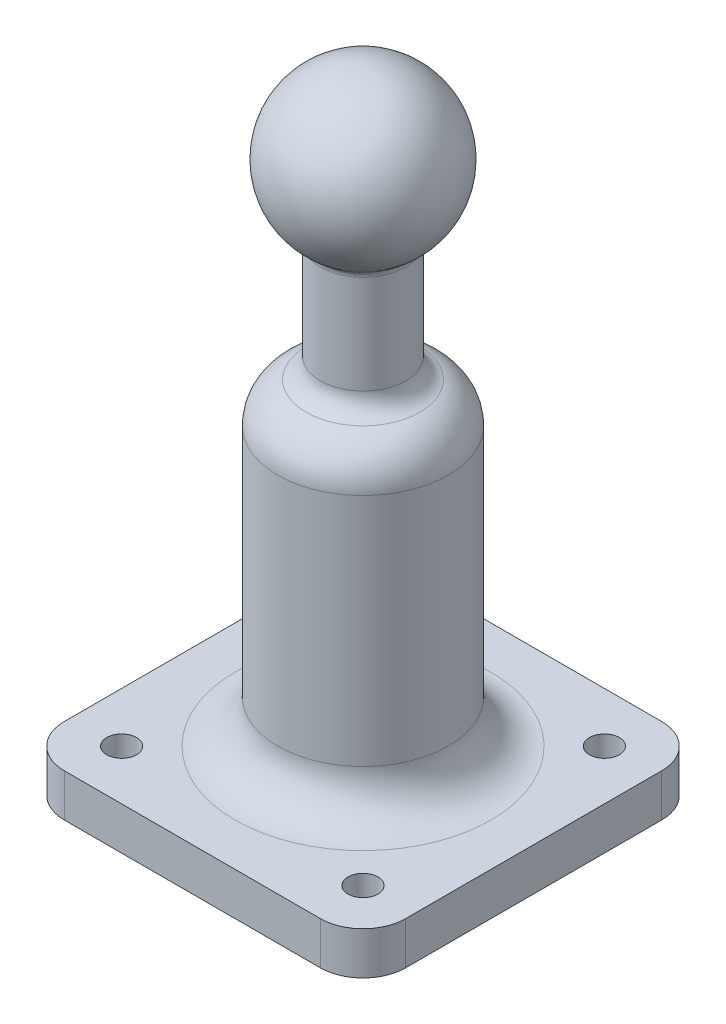
ISO-10303-21;
HEADER;
FILE_DESCRIPTION(('STEP AP214'),'2;1');
FILE_NAME('part.step','',(''),(''),'','','');
FILE_SCHEMA(('AUTOMOTIVE_DESIGN { 1 0 10303 214 1 1 1 1 }'));
ENDSEC;
DATA;
#1=APPLICATION_CONTEXT('core data for automotive mechanical design processes');
#2=APPLICATION_PROTOCOL_DEFINITION('international standard','automotive_design',2000,#1);
#3=PRODUCT_CONTEXT('',#1,'mechanical');
#4=PRODUCT('Part','Part','',(#3));
#5=PRODUCT_RELATED_PRODUCT_CATEGORY('part','',(#4));
#6=PRODUCT_DEFINITION_FORMATION('','',#4);
#7=PRODUCT_DEFINITION_CONTEXT('part definition',#1,'design');
#8=PRODUCT_DEFINITION('design','',#6,#7);
#9=PRODUCT_DEFINITION_SHAPE('','',#8);
#10=(LENGTH_UNIT() NAMED_UNIT(*) SI_UNIT(.MILLI.,.METRE.));
#11=(NAMED_UNIT(*) PLANE_ANGLE_UNIT() SI_UNIT($,.RADIAN.));
#12=(NAMED_UNIT(*) SI_UNIT($,.STERADIAN.) SOLID_ANGLE_UNIT());
#13=UNCERTAINTY_MEASURE_WITH_UNIT(LENGTH_MEASURE(1.E-05),#10,'distance_accuracy_value','');
#14=(GEOMETRIC_REPRESENTATION_CONTEXT(3) GLOBAL_UNCERTAINTY_ASSIGNED_CONTEXT((#13)) GLOBAL_UNIT_ASSIGNED_CONTEXT((#10,
#11,#12)) REPRESENTATION_CONTEXT('',''));
#15=CARTESIAN_POINT('',(0.,0.,0.));
#16=DIRECTION('',(0.,0.,1.));
#17=DIRECTION('',(1.,0.,0.));
#18=AXIS2_PLACEMENT_3D('',#15,#16,#17);
#19=CARTESIAN_POINT('',(-30.,10.,30.));
#20=DIRECTION('',(0.,1.,0.));
#21=DIRECTION('',(0.,0.,1.));
#22=AXIS2_PLACEMENT_3D('',#19,#20,#21);
#23=PLANE('',#22);
#24=CARTESIAN_POINT('',(0.,10.,0.));
#25=DIRECTION('',(0.,1.,0.));
#26=DIRECTION('',(0.,0.,1.));
#27=AXIS2_PLACEMENT_3D('',#24,#25,#26);
#28=CIRCLE('',#27,30.);
#29=CARTESIAN_POINT('',(0.,10.,30.));
#30=VERTEX_POINT('',#29);
#31=EDGE_CURVE('E170',#30,#30,#28,.F.);
#32=ORIENTED_EDGE('',*,*,#31,.T.);
#33=EDGE_LOOP('',(#32));
#34=FACE_BOUND('',#33,.T.);
#35=CARTESIAN_POINT('',(28.2842712474619,10.,28.2842712474619));
#36=DIRECTION('',(0.,1.,0.));
#37=DIRECTION('',(0.,0.,1.));
#38=AXIS2_PLACEMENT_3D('',#35,#36,#37);
#39=CIRCLE('',#38,3.5);
#40=CARTESIAN_POINT('',(28.2842712474619,10.,31.7842712474619));
#41=VERTEX_POINT('',#40);
#42=EDGE_CURVE('E284',#41,#41,#39,.T.);
#43=ORIENTED_EDGE('',*,*,#42,.F.);
#44=EDGE_LOOP('',(#43));
#45=FACE_BOUND('',#44,.T.);
#46=CARTESIAN_POINT('',(-28.2842712474619,10.,-28.2842712474619));
#47=DIRECTION('',(0.,1.,0.));
#48=DIRECTION('',(0.,0.,1.));
#49=AXIS2_PLACEMENT_3D('',#46,#47,#48);
#50=CIRCLE('',#49,3.5);
#51=CARTESIAN_POINT('',(-28.2842712474619,10.,-24.7842712474619));
#52=VERTEX_POINT('',#51);
#53=EDGE_CURVE('E138',#52,#52,#50,.T.);
#54=ORIENTED_EDGE('',*,*,#53,.F.);
#55=EDGE_LOOP('',(#54));
#56=FACE_BOUND('',#55,.T.);
#57=CARTESIAN_POINT('',(-30.,10.,30.));
#58=DIRECTION('',(0.,1.,0.));
#59=DIRECTION('',(0.,0.,1.));
#60=AXIS2_PLACEMENT_3D('',#57,#58,#59);
#61=CIRCLE('',#60,10.);
#62=CARTESIAN_POINT('',(-40.,10.,29.9999999999999));
#63=VERTEX_POINT('',#62);
#64=CARTESIAN_POINT('',(-29.9999999999999,10.,40.));
#65=VERTEX_POINT('',#64);
#66=EDGE_CURVE('E149',#63,#65,#61,.T.);
#67=ORIENTED_EDGE('',*,*,#66,.T.);
#68=DIRECTION('',(1.,0.,0.));
#69=VECTOR('',#68,1.);
#70=CARTESIAN_POINT('',(-29.9999999999999,10.,40.));
#71=LINE('',#70,#69);
#72=CARTESIAN_POINT('',(29.9999999999999,10.,40.));
#73=VERTEX_POINT('',#72);
#74=EDGE_CURVE('E97',#65,#73,#71,.T.);
#75=ORIENTED_EDGE('',*,*,#74,.T.);
#76=CARTESIAN_POINT('',(30.,10.,30.));
#77=DIRECTION('',(0.,1.,0.));
#78=DIRECTION('',(0.,0.,1.));
#79=AXIS2_PLACEMENT_3D('',#76,#77,#78);
#80=CIRCLE('',#79,10.);
#81=CARTESIAN_POINT('',(40.,10.,29.9999999999999));
#82=VERTEX_POINT('',#81);
#83=EDGE_CURVE('E299',#73,#82,#80,.T.);
#84=ORIENTED_EDGE('',*,*,#83,.T.);
#85=DIRECTION('',(0.,0.,-1.));
#86=VECTOR('',#85,1.);
#87=CARTESIAN_POINT('',(40.,10.,-29.9999999999999));
#88=LINE('',#87,#86);
#89=CARTESIAN_POINT('',(40.,10.,-29.9999999999999));
#90=VERTEX_POINT('',#89);
#91=EDGE_CURVE('E301',#82,#90,#88,.T.);
#92=ORIENTED_EDGE('',*,*,#91,.T.);
#93=CARTESIAN_POINT('',(30.,10.,-30.));
#94=DIRECTION('',(0.,1.,0.));
#95=DIRECTION('',(0.,0.,-1.));
#96=AXIS2_PLACEMENT_3D('',#93,#94,#95);
#97=CIRCLE('',#96,10.);
#98=CARTESIAN_POINT('',(29.9999999999999,10.,-40.));
#99=VERTEX_POINT('',#98);
#100=EDGE_CURVE('E116',#90,#99,#97,.T.);
#101=ORIENTED_EDGE('',*,*,#100,.T.);
#102=DIRECTION('',(-1.,0.,0.));
#103=VECTOR('',#102,1.);
#104=CARTESIAN_POINT('',(-29.9999999999999,10.,-40.));
#105=LINE('',#104,#103);
#106=CARTESIAN_POINT('',(-29.9999999999999,10.,-40.));
#107=VERTEX_POINT('',#106);
#108=EDGE_CURVE('E110',#99,#107,#105,.T.);
#109=ORIENTED_EDGE('',*,*,#108,.T.);
#110=CARTESIAN_POINT('',(-30.,10.,-30.));
#111=DIRECTION('',(0.,1.,0.));
#112=DIRECTION('',(0.,0.,1.));
#113=AXIS2_PLACEMENT_3D('',#110,#111,#112);
#114=CIRCLE('',#113,10.);
#115=CARTESIAN_POINT('',(-40.,10.,-29.9999999999999));
#116=VERTEX_POINT('',#115);
#117=EDGE_CURVE('E114',#107,#116,#114,.T.);
#118=ORIENTED_EDGE('',*,*,#117,.T.);
#119=DIRECTION('',(0.,0.,1.));
#120=VECTOR('',#119,1.);
#121=CARTESIAN_POINT('',(-40.,10.,-29.9999999999999));
#122=LINE('',#121,#120);
#123=EDGE_CURVE('E53',#116,#63,#122,.T.);
#124=ORIENTED_EDGE('',*,*,#123,.T.);
#125=EDGE_LOOP('',(#67,#75,#84,#92,#101,#109,#118,#124));
#126=FACE_BOUND('',#125,.T.);
#127=CARTESIAN_POINT('',(28.2842712474619,10.,-28.2842712474619));
#128=DIRECTION('',(0.,1.,0.));
#129=DIRECTION('',(0.,0.,1.));
#130=AXIS2_PLACEMENT_3D('',#127,#128,#129);
#131=CIRCLE('',#130,3.5);
#132=CARTESIAN_POINT('',(28.2842712474619,10.,-24.7842712474619));
#133=VERTEX_POINT('',#132);
#134=EDGE_CURVE('E279',#133,#133,#131,.T.);
#135=ORIENTED_EDGE('',*,*,#134,.F.);
#136=EDGE_LOOP('',(#135));
#137=FACE_BOUND('',#136,.T.);
#138=CARTESIAN_POINT('',(-28.2842712474619,10.,28.2842712474619));
#139=DIRECTION('',(0.,1.,0.));
#140=DIRECTION('',(0.,0.,1.));
#141=AXIS2_PLACEMENT_3D('',#138,#139,#140);
#142=CIRCLE('',#141,3.5);
#143=CARTESIAN_POINT('',(-28.2842712474619,10.,31.7842712474619));
#144=VERTEX_POINT('',#143);
#145=EDGE_CURVE('E322',#144,#144,#142,.T.);
#146=ORIENTED_EDGE('',*,*,#145,.F.);
#147=EDGE_LOOP('',(#146));
#148=FACE_BOUND('',#147,.T.);
#149=ADVANCED_FACE('F36',(#34,#45,#56,#126,#137,#148),#23,.T.);
#150=CARTESIAN_POINT('',(-30.,0.,30.));
#151=DIRECTION('',(0.,1.,0.));
#152=DIRECTION('',(0.,0.,1.));
#153=AXIS2_PLACEMENT_3D('',#150,#151,#152);
#154=PLANE('',#153);
#155=CARTESIAN_POINT('',(-30.,0.,30.));
#156=DIRECTION('',(0.,1.,0.));
#157=DIRECTION('',(0.,0.,1.));
#158=AXIS2_PLACEMENT_3D('',#155,#156,#157);
#159=CIRCLE('',#158,10.);
#160=CARTESIAN_POINT('',(-40.,0.,29.9999999999999));
#161=VERTEX_POINT('',#160);
#162=CARTESIAN_POINT('',(-29.9999999999999,0.,40.));
#163=VERTEX_POINT('',#162);
#164=EDGE_CURVE('E134',#161,#163,#159,.T.);
#165=ORIENTED_EDGE('',*,*,#164,.F.);
#166=DIRECTION('',(0.,0.,1.));
#167=VECTOR('',#166,1.);
#168=CARTESIAN_POINT('',(-40.,0.,-29.9999999999999));
#169=LINE('',#168,#167);
#170=CARTESIAN_POINT('',(-40.,0.,-29.9999999999999));
#171=VERTEX_POINT('',#170);
#172=EDGE_CURVE('E88',#171,#161,#169,.T.);
#173=ORIENTED_EDGE('',*,*,#172,.F.);
#174=CARTESIAN_POINT('',(-30.,0.,-30.));
#175=DIRECTION('',(0.,1.,0.));
#176=DIRECTION('',(0.,0.,1.));
#177=AXIS2_PLACEMENT_3D('',#174,#175,#176);
#178=CIRCLE('',#177,10.);
#179=CARTESIAN_POINT('',(-29.9999999999999,0.,-40.));
#180=VERTEX_POINT('',#179);
#181=EDGE_CURVE('E82',#180,#171,#178,.T.);
#182=ORIENTED_EDGE('',*,*,#181,.F.);
#183=DIRECTION('',(-1.,0.,0.));
#184=VECTOR('',#183,1.);
#185=CARTESIAN_POINT('',(-29.9999999999999,0.,-40.));
#186=LINE('',#185,#184);
#187=CARTESIAN_POINT('',(29.9999999999999,0.,-40.));
#188=VERTEX_POINT('',#187);
#189=EDGE_CURVE('E124',#188,#180,#186,.T.);
#190=ORIENTED_EDGE('',*,*,#189,.F.);
#191=CARTESIAN_POINT('',(30.,0.,-30.));
#192=DIRECTION('',(0.,1.,0.));
#193=DIRECTION('',(0.,0.,-1.));
#194=AXIS2_PLACEMENT_3D('',#191,#192,#193);
#195=CIRCLE('',#194,10.);
#196=CARTESIAN_POINT('',(40.,0.,-29.9999999999999));
#197=VERTEX_POINT('',#196);
#198=EDGE_CURVE('E144',#197,#188,#195,.T.);
#199=ORIENTED_EDGE('',*,*,#198,.F.);
#200=DIRECTION('',(0.,0.,-1.));
#201=VECTOR('',#200,1.);
#202=CARTESIAN_POINT('',(40.,0.,-29.9999999999999));
#203=LINE('',#202,#201);
#204=CARTESIAN_POINT('',(40.,0.,29.9999999999999));
#205=VERTEX_POINT('',#204);
#206=EDGE_CURVE('E142',#205,#197,#203,.T.);
#207=ORIENTED_EDGE('',*,*,#206,.F.);
#208=CARTESIAN_POINT('',(30.,0.,30.));
#209=DIRECTION('',(0.,1.,0.));
#210=DIRECTION('',(0.,0.,1.));
#211=AXIS2_PLACEMENT_3D('',#208,#209,#210);
#212=CIRCLE('',#211,10.);
#213=CARTESIAN_POINT('',(29.9999999999999,0.,40.));
#214=VERTEX_POINT('',#213);
#215=EDGE_CURVE('E140',#214,#205,#212,.T.);
#216=ORIENTED_EDGE('',*,*,#215,.F.);
#217=DIRECTION('',(1.,0.,0.));
#218=VECTOR('',#217,1.);
#219=CARTESIAN_POINT('',(-29.9999999999999,0.,40.));
#220=LINE('',#219,#218);
#221=EDGE_CURVE('E137',#163,#214,#220,.T.);
#222=ORIENTED_EDGE('',*,*,#221,.F.);
#223=EDGE_LOOP('',(#165,#173,#182,#190,#199,#207,#216,#222));
#224=FACE_BOUND('',#223,.T.);
#225=CARTESIAN_POINT('',(-28.2842712474619,0.,-28.2842712474619));
#226=DIRECTION('',(0.,1.,0.));
#227=DIRECTION('',(0.,0.,1.));
#228=AXIS2_PLACEMENT_3D('',#225,#226,#227);
#229=CIRCLE('',#228,3.5);
#230=CARTESIAN_POINT('',(-28.2842712474619,0.,-24.7842712474619));
#231=VERTEX_POINT('',#230);
#232=EDGE_CURVE('E286',#231,#231,#229,.T.);
#233=ORIENTED_EDGE('',*,*,#232,.T.);
#234=EDGE_LOOP('',(#233));
#235=FACE_BOUND('',#234,.T.);
#236=CARTESIAN_POINT('',(28.2842712474619,0.,-28.2842712474619));
#237=DIRECTION('',(0.,1.,0.));
#238=DIRECTION('',(0.,0.,1.));
#239=AXIS2_PLACEMENT_3D('',#236,#237,#238);
#240=CIRCLE('',#239,3.5);
#241=CARTESIAN_POINT('',(28.2842712474619,0.,-24.7842712474619));
#242=VERTEX_POINT('',#241);
#243=EDGE_CURVE('E282',#242,#242,#240,.T.);
#244=ORIENTED_EDGE('',*,*,#243,.T.);
#245=EDGE_LOOP('',(#244));
#246=FACE_BOUND('',#245,.T.);
#247=CARTESIAN_POINT('',(28.2842712474619,0.,28.2842712474619));
#248=DIRECTION('',(0.,1.,0.));
#249=DIRECTION('',(0.,0.,1.));
#250=AXIS2_PLACEMENT_3D('',#247,#248,#249);
#251=CIRCLE('',#250,3.5);
#252=CARTESIAN_POINT('',(28.2842712474619,0.,31.7842712474619));
#253=VERTEX_POINT('',#252);
#254=EDGE_CURVE('E289',#253,#253,#251,.T.);
#255=ORIENTED_EDGE('',*,*,#254,.T.);
#256=EDGE_LOOP('',(#255));
#257=FACE_BOUND('',#256,.T.);
#258=CARTESIAN_POINT('',(-28.2842712474619,0.,28.2842712474619));
#259=DIRECTION('',(0.,1.,0.));
#260=DIRECTION('',(0.,0.,1.));
#261=AXIS2_PLACEMENT_3D('',#258,#259,#260);
#262=CIRCLE('',#261,3.5);
#263=CARTESIAN_POINT('',(-28.2842712474619,0.,31.7842712474619));
#264=VERTEX_POINT('',#263);
#265=EDGE_CURVE('E320',#264,#264,#262,.T.);
#266=ORIENTED_EDGE('',*,*,#265,.T.);
#267=EDGE_LOOP('',(#266));
#268=FACE_BOUND('',#267,.T.);
#269=ADVANCED_FACE('F195',(#224,#235,#246,#257,#268),#154,.F.);
#270=CARTESIAN_POINT('',(-30.,10.,30.));
#271=DIRECTION('',(0.,-1.,0.));
#272=DIRECTION('',(0.,0.,-1.));
#273=AXIS2_PLACEMENT_3D('',#270,#271,#272);
#274=CYLINDRICAL_SURFACE('',#273,10.);
#275=ORIENTED_EDGE('',*,*,#164,.T.);
#276=DIRECTION('',(0.,-1.,0.));
#277=VECTOR('',#276,1.);
#278=CARTESIAN_POINT('',(-29.9999999999999,10.,40.));
#279=LINE('',#278,#277);
#280=EDGE_CURVE('E162',#65,#163,#279,.T.);
#281=ORIENTED_EDGE('',*,*,#280,.F.);
#282=ORIENTED_EDGE('',*,*,#66,.F.);
#283=DIRECTION('',(0.,-1.,0.));
#284=VECTOR('',#283,1.);
#285=CARTESIAN_POINT('',(-40.,10.,29.9999999999999));
#286=LINE('',#285,#284);
#287=EDGE_CURVE('E130',#63,#161,#286,.T.);
#288=ORIENTED_EDGE('',*,*,#287,.T.);
#289=EDGE_LOOP('',(#275,#281,#282,#288));
#290=FACE_BOUND('',#289,.T.);
#291=ADVANCED_FACE('F201',(#290),#274,.T.);
#292=CARTESIAN_POINT('',(-29.9999999999999,10.,40.));
#293=DIRECTION('',(0.,0.,-1.));
#294=DIRECTION('',(-1.,0.,0.));
#295=AXIS2_PLACEMENT_3D('',#292,#293,#294);
#296=PLANE('',#295);
#297=ORIENTED_EDGE('',*,*,#221,.T.);
#298=DIRECTION('',(0.,-1.,0.));
#299=VECTOR('',#298,1.);
#300=CARTESIAN_POINT('',(29.9999999999999,10.,40.));
#301=LINE('',#300,#299);
#302=EDGE_CURVE('E159',#73,#214,#301,.T.);
#303=ORIENTED_EDGE('',*,*,#302,.F.);
#304=ORIENTED_EDGE('',*,*,#74,.F.);
#305=ORIENTED_EDGE('',*,*,#280,.T.);
#306=EDGE_LOOP('',(#297,#303,#304,#305));
#307=FACE_BOUND('',#306,.T.);
#308=ADVANCED_FACE('F227',(#307),#296,.F.);
#309=CARTESIAN_POINT('',(30.,10.,30.));
#310=DIRECTION('',(0.,-1.,0.));
#311=DIRECTION('',(0.,0.,-1.));
#312=AXIS2_PLACEMENT_3D('',#309,#310,#311);
#313=CYLINDRICAL_SURFACE('',#312,10.);
#314=ORIENTED_EDGE('',*,*,#215,.T.);
#315=DIRECTION('',(0.,-1.,0.));
#316=VECTOR('',#315,1.);
#317=CARTESIAN_POINT('',(40.,10.,29.9999999999999));
#318=LINE('',#317,#316);
#319=EDGE_CURVE('E156',#82,#205,#318,.T.);
#320=ORIENTED_EDGE('',*,*,#319,.F.);
#321=ORIENTED_EDGE('',*,*,#83,.F.);
#322=ORIENTED_EDGE('',*,*,#302,.T.);
#323=EDGE_LOOP('',(#314,#320,#321,#322));
#324=FACE_BOUND('',#323,.T.);
#325=ADVANCED_FACE('F223',(#324),#313,.T.);
#326=CARTESIAN_POINT('',(40.,10.,-29.9999999999999));
#327=DIRECTION('',(-1.,0.,0.));
#328=DIRECTION('',(0.,0.,1.));
#329=AXIS2_PLACEMENT_3D('',#326,#327,#328);
#330=PLANE('',#329);
#331=ORIENTED_EDGE('',*,*,#206,.T.);
#332=DIRECTION('',(0.,-1.,0.));
#333=VECTOR('',#332,1.);
#334=CARTESIAN_POINT('',(40.,10.,-29.9999999999999));
#335=LINE('',#334,#333);
#336=EDGE_CURVE('E153',#90,#197,#335,.T.);
#337=ORIENTED_EDGE('',*,*,#336,.F.);
#338=ORIENTED_EDGE('',*,*,#91,.F.);
#339=ORIENTED_EDGE('',*,*,#319,.T.);
#340=EDGE_LOOP('',(#331,#337,#338,#339));
#341=FACE_BOUND('',#340,.T.);
#342=ADVANCED_FACE('F219',(#341),#330,.F.);
#343=CARTESIAN_POINT('',(30.,10.,-30.));
#344=DIRECTION('',(0.,-1.,0.));
#345=DIRECTION('',(0.,0.,-1.));
#346=AXIS2_PLACEMENT_3D('',#343,#344,#345);
#347=CYLINDRICAL_SURFACE('',#346,10.);
#348=ORIENTED_EDGE('',*,*,#198,.T.);
#349=DIRECTION('',(0.,-1.,0.));
#350=VECTOR('',#349,1.);
#351=CARTESIAN_POINT('',(29.9999999999999,10.,-40.));
#352=LINE('',#351,#350);
#353=EDGE_CURVE('E125',#99,#188,#352,.T.);
#354=ORIENTED_EDGE('',*,*,#353,.F.);
#355=ORIENTED_EDGE('',*,*,#100,.F.);
#356=ORIENTED_EDGE('',*,*,#336,.T.);
#357=EDGE_LOOP('',(#348,#354,#355,#356));
#358=FACE_BOUND('',#357,.T.);
#359=ADVANCED_FACE('F216',(#358),#347,.T.);
#360=CARTESIAN_POINT('',(-29.9999999999999,10.,-40.));
#361=DIRECTION('',(0.,0.,1.));
#362=DIRECTION('',(1.,0.,0.));
#363=AXIS2_PLACEMENT_3D('',#360,#361,#362);
#364=PLANE('',#363);
#365=ORIENTED_EDGE('',*,*,#189,.T.);
#366=DIRECTION('',(0.,-1.,0.));
#367=VECTOR('',#366,1.);
#368=CARTESIAN_POINT('',(-29.9999999999999,10.,-40.));
#369=LINE('',#368,#367);
#370=EDGE_CURVE('E121',#107,#180,#369,.T.);
#371=ORIENTED_EDGE('',*,*,#370,.F.);
#372=ORIENTED_EDGE('',*,*,#108,.F.);
#373=ORIENTED_EDGE('',*,*,#353,.T.);
#374=EDGE_LOOP('',(#365,#371,#372,#373));
#375=FACE_BOUND('',#374,.T.);
#376=ADVANCED_FACE('F122',(#375),#364,.F.);
#377=CARTESIAN_POINT('',(-30.,10.,-30.));
#378=DIRECTION('',(0.,-1.,0.));
#379=DIRECTION('',(0.,0.,-1.));
#380=AXIS2_PLACEMENT_3D('',#377,#378,#379);
#381=CYLINDRICAL_SURFACE('',#380,10.);
#382=ORIENTED_EDGE('',*,*,#181,.T.);
#383=DIRECTION('',(0.,-1.,0.));
#384=VECTOR('',#383,1.);
#385=CARTESIAN_POINT('',(-40.,10.,-29.9999999999999));
#386=LINE('',#385,#384);
#387=EDGE_CURVE('E126',#116,#171,#386,.T.);
#388=ORIENTED_EDGE('',*,*,#387,.F.);
#389=ORIENTED_EDGE('',*,*,#117,.F.);
#390=ORIENTED_EDGE('',*,*,#370,.T.);
#391=EDGE_LOOP('',(#382,#388,#389,#390));
#392=FACE_BOUND('',#391,.T.);
#393=ADVANCED_FACE('F128',(#392),#381,.T.);
#394=CARTESIAN_POINT('',(-40.,10.,-29.9999999999999));
#395=DIRECTION('',(1.,0.,0.));
#396=DIRECTION('',(0.,0.,-1.));
#397=AXIS2_PLACEMENT_3D('',#394,#395,#396);
#398=PLANE('',#397);
#399=ORIENTED_EDGE('',*,*,#172,.T.);
#400=ORIENTED_EDGE('',*,*,#287,.F.);
#401=ORIENTED_EDGE('',*,*,#123,.F.);
#402=ORIENTED_EDGE('',*,*,#387,.T.);
#403=EDGE_LOOP('',(#399,#400,#401,#402));
#404=FACE_BOUND('',#403,.T.);
#405=ADVANCED_FACE('F209',(#404),#398,.F.);
#406=CARTESIAN_POINT('',(-28.2842712474619,10.,-28.2842712474619));
#407=DIRECTION('',(0.,-1.,0.));
#408=DIRECTION('',(0.,0.,-1.));
#409=AXIS2_PLACEMENT_3D('',#406,#407,#408);
#410=CYLINDRICAL_SURFACE('',#409,3.5);
#411=ORIENTED_EDGE('',*,*,#53,.T.);
#412=EDGE_LOOP('',(#411));
#413=FACE_BOUND('',#412,.T.);
#414=ORIENTED_EDGE('',*,*,#232,.F.);
#415=EDGE_LOOP('',(#414));
#416=FACE_BOUND('',#415,.T.);
#417=ADVANCED_FACE('F206',(#413,#416),#410,.F.);
#418=CARTESIAN_POINT('',(28.2842712474619,10.,-28.2842712474619));
#419=DIRECTION('',(0.,-1.,0.));
#420=DIRECTION('',(0.,0.,-1.));
#421=AXIS2_PLACEMENT_3D('',#418,#419,#420);
#422=CYLINDRICAL_SURFACE('',#421,3.5);
#423=ORIENTED_EDGE('',*,*,#134,.T.);
#424=EDGE_LOOP('',(#423));
#425=FACE_BOUND('',#424,.T.);
#426=ORIENTED_EDGE('',*,*,#243,.F.);
#427=EDGE_LOOP('',(#426));
#428=FACE_BOUND('',#427,.T.);
#429=ADVANCED_FACE('F268',(#425,#428),#422,.F.);
#430=CARTESIAN_POINT('',(28.2842712474619,10.,28.2842712474619));
#431=DIRECTION('',(0.,-1.,0.));
#432=DIRECTION('',(0.,0.,-1.));
#433=AXIS2_PLACEMENT_3D('',#430,#431,#432);
#434=CYLINDRICAL_SURFACE('',#433,3.5);
#435=ORIENTED_EDGE('',*,*,#42,.T.);
#436=EDGE_LOOP('',(#435));
#437=FACE_BOUND('',#436,.T.);
#438=ORIENTED_EDGE('',*,*,#254,.F.);
#439=EDGE_LOOP('',(#438));
#440=FACE_BOUND('',#439,.T.);
#441=ADVANCED_FACE('F263',(#437,#440),#434,.F.);
#442=CARTESIAN_POINT('',(-28.2842712474619,10.,28.2842712474619));
#443=DIRECTION('',(0.,-1.,0.));
#444=DIRECTION('',(0.,0.,-1.));
#445=AXIS2_PLACEMENT_3D('',#442,#443,#444);
#446=CYLINDRICAL_SURFACE('',#445,3.5);
#447=ORIENTED_EDGE('',*,*,#145,.T.);
#448=EDGE_LOOP('',(#447));
#449=FACE_BOUND('',#448,.T.);
#450=ORIENTED_EDGE('',*,*,#265,.F.);
#451=EDGE_LOOP('',(#450));
#452=FACE_BOUND('',#451,.T.);
#453=ADVANCED_FACE('F256',(#449,#452),#446,.F.);
#454=CARTESIAN_POINT('',(0.,85.,0.));
#455=DIRECTION('',(0.,-1.,0.));
#456=DIRECTION('',(0.,0.,-1.));
#457=AXIS2_PLACEMENT_3D('',#454,#455,#456);
#458=CYLINDRICAL_SURFACE('',#457,20.);
#459=CARTESIAN_POINT('',(0.,75.,0.));
#460=DIRECTION('',(0.,1.,0.));
#461=DIRECTION('',(0.,0.,1.));
#462=AXIS2_PLACEMENT_3D('',#459,#460,#461);
#463=CIRCLE('',#462,20.);
#464=CARTESIAN_POINT('',(0.,75.,20.));
#465=VERTEX_POINT('',#464);
#466=EDGE_CURVE('E167',#465,#465,#463,.F.);
#467=ORIENTED_EDGE('',*,*,#466,.T.);
#468=EDGE_LOOP('',(#467));
#469=FACE_BOUND('',#468,.T.);
#470=CARTESIAN_POINT('',(0.,20.,0.));
#471=DIRECTION('',(0.,1.,0.));
#472=DIRECTION('',(0.,0.,1.));
#473=AXIS2_PLACEMENT_3D('',#470,#471,#472);
#474=CIRCLE('',#473,20.);
#475=CARTESIAN_POINT('',(0.,20.,20.));
#476=VERTEX_POINT('',#475);
#477=EDGE_CURVE('E164',#476,#476,#474,.T.);
#478=ORIENTED_EDGE('',*,*,#477,.T.);
#479=EDGE_LOOP('',(#478));
#480=FACE_BOUND('',#479,.T.);
#481=ADVANCED_FACE('F238',(#469,#480),#458,.T.);
#482=CARTESIAN_POINT('',(0.,75.,0.));
#483=DIRECTION('',(0.,1.,0.));
#484=DIRECTION('',(0.,0.,1.));
#485=AXIS2_PLACEMENT_3D('',#482,#483,#484);
#486=DEGENERATE_TOROIDAL_SURFACE('',#485,10.,10.,.T.);
#487=CARTESIAN_POINT('',(0.,84.4280904158206,0.));
#488=DIRECTION('',(0.,-1.,0.));
#489=DIRECTION('',(0.,0.,-1.));
#490=AXIS2_PLACEMENT_3D('',#487,#488,#489);
#491=CIRCLE('',#490,13.3333333333333);
#492=CARTESIAN_POINT('',(0.,84.4280904158206,-13.3333333333333));
#493=VERTEX_POINT('',#492);
#494=EDGE_CURVE('E176',#493,#493,#491,.T.);
#495=ORIENTED_EDGE('',*,*,#494,.T.);
#496=EDGE_LOOP('',(#495));
#497=FACE_BOUND('',#496,.T.);
#498=ORIENTED_EDGE('',*,*,#466,.F.);
#499=EDGE_LOOP('',(#498));
#500=FACE_BOUND('',#499,.T.);
#501=ADVANCED_FACE('F234',(#497,#500),#486,.T.);
#502=CARTESIAN_POINT('',(0.,20.,0.));
#503=DIRECTION('',(0.,1.,0.));
#504=DIRECTION('',(0.,0.,1.));
#505=AXIS2_PLACEMENT_3D('',#502,#503,#504);
#506=TOROIDAL_SURFACE('',#505,30.,10.);
#507=ORIENTED_EDGE('',*,*,#31,.F.);
#508=EDGE_LOOP('',(#507));
#509=FACE_BOUND('',#508,.T.);
#510=ORIENTED_EDGE('',*,*,#477,.F.);
#511=EDGE_LOOP('',(#510));
#512=FACE_BOUND('',#511,.T.);
#513=ADVANCED_FACE('F237',(#509,#512),#506,.F.);
#514=CARTESIAN_POINT('',(0.,115.,0.));
#515=DIRECTION('',(0.,-1.,0.));
#516=DIRECTION('',(0.,0.,-1.));
#517=AXIS2_PLACEMENT_3D('',#514,#515,#516);
#518=CYLINDRICAL_SURFACE('',#517,10.);
#519=CARTESIAN_POINT('',(0.,112.213978606501,0.));
#520=DIRECTION('',(0.,1.,0.));
#521=DIRECTION('',(0.,0.,1.));
#522=AXIS2_PLACEMENT_3D('',#519,#520,#521);
#523=CIRCLE('',#522,10.);
#524=CARTESIAN_POINT('',(0.,112.213978606501,10.));
#525=VERTEX_POINT('',#524);
#526=EDGE_CURVE('E45',#525,#525,#523,.F.);
#527=ORIENTED_EDGE('',*,*,#526,.T.);
#528=EDGE_LOOP('',(#527));
#529=FACE_BOUND('',#528,.T.);
#530=CARTESIAN_POINT('',(0.,89.1421356237309,0.));
#531=DIRECTION('',(0.,1.,0.));
#532=DIRECTION('',(0.,0.,1.));
#533=AXIS2_PLACEMENT_3D('',#530,#531,#532);
#534=CIRCLE('',#533,10.);
#535=CARTESIAN_POINT('',(0.,89.1421356237309,10.));
#536=VERTEX_POINT('',#535);
#537=EDGE_CURVE('E173',#536,#536,#534,.T.);
#538=ORIENTED_EDGE('',*,*,#537,.T.);
#539=EDGE_LOOP('',(#538));
#540=FACE_BOUND('',#539,.T.);
#541=ADVANCED_FACE('F181',(#529,#540),#518,.T.);
#542=CARTESIAN_POINT('',(0.,89.1421356237309,0.));
#543=DIRECTION('',(0.,1.,0.));
#544=DIRECTION('',(0.,0.,1.));
#545=AXIS2_PLACEMENT_3D('',#542,#543,#544);
#546=TOROIDAL_SURFACE('',#545,15.,5.);
#547=ORIENTED_EDGE('',*,*,#494,.F.);
#548=EDGE_LOOP('',(#547));
#549=FACE_BOUND('',#548,.T.);
#550=ORIENTED_EDGE('',*,*,#537,.F.);
#551=EDGE_LOOP('',(#550));
#552=FACE_BOUND('',#551,.T.);
#553=ADVANCED_FACE('F190',(#549,#552),#546,.F.);
#554=CARTESIAN_POINT('',(0.,129.142135623731,0.));
#555=DIRECTION('',(0.,-1.,0.));
#556=DIRECTION('',(-1.,0.,0.));
#557=AXIS2_PLACEMENT_3D('',#554,#555,#556);
#558=SPHERICAL_SURFACE('',#557,18.75);
#559=CARTESIAN_POINT('',(0.,113.845608198523,0.));
#560=DIRECTION('',(0.,1.,0.));
#561=DIRECTION('',(0.,0.,1.));
#562=AXIS2_PLACEMENT_3D('',#559,#560,#561);
#563=CIRCLE('',#562,10.8433734939759);
#564=CARTESIAN_POINT('',(0.,113.845608198523,10.8433734939759));
#565=VERTEX_POINT('',#564);
#566=EDGE_CURVE('E11',#565,#565,#563,.T.);
#567=ORIENTED_EDGE('',*,*,#566,.T.);
#568=EDGE_LOOP('',(#567));
#569=FACE_BOUND('',#568,.T.);
#570=ADVANCED_FACE('F185',(#569),#558,.T.);
#571=CARTESIAN_POINT('',(0.,112.213978606501,0.));
#572=DIRECTION('',(0.,1.,0.));
#573=DIRECTION('',(0.,0.,1.));
#574=AXIS2_PLACEMENT_3D('',#571,#572,#573);
#575=TOROIDAL_SURFACE('',#574,12.,2.);
#576=ORIENTED_EDGE('',*,*,#566,.F.);
#577=EDGE_LOOP('',(#576));
#578=FACE_BOUND('',#577,.T.);
#579=ORIENTED_EDGE('',*,*,#526,.F.);
#580=EDGE_LOOP('',(#579));
#581=FACE_BOUND('',#580,.T.);
#582=ADVANCED_FACE('F38',(#578,#581),#575,.F.);
#583=CLOSED_SHELL('',(#149,#269,#291,#308,#325,#342,#359,#376,#393,#405,#417,#429,#441,#453,
#481,#501,#513,#541,#553,#570,#582));
#584=MANIFOLD_SOLID_BREP('B2',#583);
#585=ADVANCED_BREP_SHAPE_REPRESENTATION('',(#18,#584),#14);
#586=SHAPE_DEFINITION_REPRESENTATION(#9,#585);
ENDSEC;
END-ISO-10303-21;
